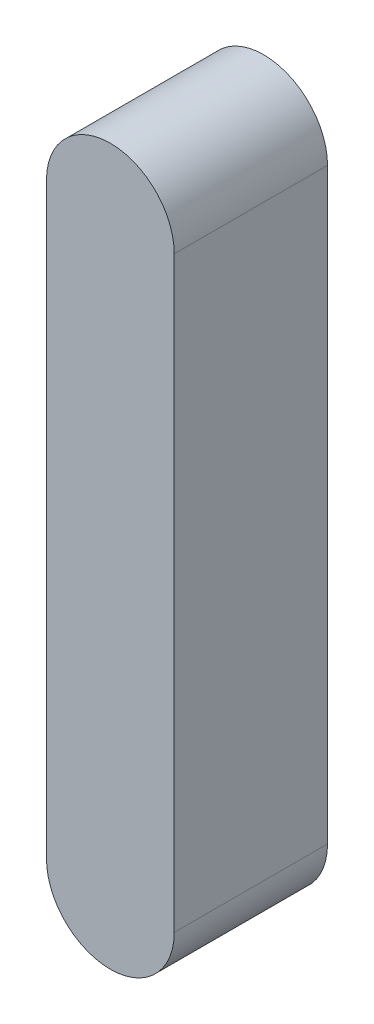
ISO-10303-21;
HEADER;
FILE_DESCRIPTION(('STEP AP214'),'2;1');
FILE_NAME('part.step','',(''),(''),'','','');
FILE_SCHEMA(('AUTOMOTIVE_DESIGN { 1 0 10303 214 1 1 1 1 }'));
ENDSEC;
DATA;
#1=APPLICATION_CONTEXT('core data for automotive mechanical design processes');
#2=APPLICATION_PROTOCOL_DEFINITION('international standard','automotive_design',2000,#1);
#3=PRODUCT_CONTEXT('',#1,'mechanical');
#4=PRODUCT('Part','Part','',(#3));
#5=PRODUCT_RELATED_PRODUCT_CATEGORY('part','',(#4));
#6=PRODUCT_DEFINITION_FORMATION('','',#4);
#7=PRODUCT_DEFINITION_CONTEXT('part definition',#1,'design');
#8=PRODUCT_DEFINITION('design','',#6,#7);
#9=PRODUCT_DEFINITION_SHAPE('','',#8);
#10=(LENGTH_UNIT() NAMED_UNIT(*) SI_UNIT(.MILLI.,.METRE.));
#11=(NAMED_UNIT(*) PLANE_ANGLE_UNIT() SI_UNIT($,.RADIAN.));
#12=(NAMED_UNIT(*) SI_UNIT($,.STERADIAN.) SOLID_ANGLE_UNIT());
#13=UNCERTAINTY_MEASURE_WITH_UNIT(LENGTH_MEASURE(1.E-05),#10,'distance_accuracy_value','');
#14=(GEOMETRIC_REPRESENTATION_CONTEXT(3) GLOBAL_UNCERTAINTY_ASSIGNED_CONTEXT((#13)) GLOBAL_UNIT_ASSIGNED_CONTEXT((#10,
#11,#12)) REPRESENTATION_CONTEXT('',''));
#15=CARTESIAN_POINT('',(0.,0.,0.));
#16=DIRECTION('',(0.,0.,1.));
#17=DIRECTION('',(1.,0.,0.));
#18=AXIS2_PLACEMENT_3D('',#15,#16,#17);
#19=CARTESIAN_POINT('',(0.,0.,15.));
#20=DIRECTION('',(0.,0.,-1.));
#21=DIRECTION('',(-1.,0.,0.));
#22=AXIS2_PLACEMENT_3D('',#19,#20,#21);
#23=CYLINDRICAL_SURFACE('',#22,12.5);
#24=CARTESIAN_POINT('',(0.,0.,-15.));
#25=DIRECTION('',(0.,0.,1.));
#26=DIRECTION('',(1.,0.,0.));
#27=AXIS2_PLACEMENT_3D('',#24,#25,#26);
#28=CIRCLE('',#27,12.5);
#29=CARTESIAN_POINT('',(-12.5,0.,-15.));
#30=VERTEX_POINT('',#29);
#31=CARTESIAN_POINT('',(12.5,0.,-15.));
#32=VERTEX_POINT('',#31);
#33=EDGE_CURVE('E106',#30,#32,#28,.T.);
#34=ORIENTED_EDGE('',*,*,#33,.T.);
#35=DIRECTION('',(0.,0.,-1.));
#36=VECTOR('',#35,1.);
#37=CARTESIAN_POINT('',(12.5,0.,15.));
#38=LINE('',#37,#36);
#39=CARTESIAN_POINT('',(12.5,0.,15.));
#40=VERTEX_POINT('',#39);
#41=EDGE_CURVE('E11',#40,#32,#38,.T.);
#42=ORIENTED_EDGE('',*,*,#41,.F.);
#43=CARTESIAN_POINT('',(0.,0.,15.));
#44=DIRECTION('',(0.,0.,1.));
#45=DIRECTION('',(1.,0.,0.));
#46=AXIS2_PLACEMENT_3D('',#43,#44,#45);
#47=CIRCLE('',#46,12.5);
#48=CARTESIAN_POINT('',(-12.5,0.,15.));
#49=VERTEX_POINT('',#48);
#50=EDGE_CURVE('E94',#49,#40,#47,.T.);
#51=ORIENTED_EDGE('',*,*,#50,.F.);
#52=DIRECTION('',(0.,0.,-1.));
#53=VECTOR('',#52,1.);
#54=CARTESIAN_POINT('',(-12.5,0.,15.));
#55=LINE('',#54,#53);
#56=EDGE_CURVE('E102',#49,#30,#55,.T.);
#57=ORIENTED_EDGE('',*,*,#56,.T.);
#58=EDGE_LOOP('',(#34,#42,#51,#57));
#59=FACE_BOUND('',#58,.T.);
#60=ADVANCED_FACE('F43',(#59),#23,.T.);
#61=CARTESIAN_POINT('',(12.5,0.,15.));
#62=DIRECTION('',(-1.,0.,0.));
#63=DIRECTION('',(0.,0.,1.));
#64=AXIS2_PLACEMENT_3D('',#61,#62,#63);
#65=PLANE('',#64);
#66=DIRECTION('',(0.,1.,0.));
#67=VECTOR('',#66,1.);
#68=CARTESIAN_POINT('',(12.5,0.,-15.));
#69=LINE('',#68,#67);
#70=CARTESIAN_POINT('',(12.5,115.,-15.));
#71=VERTEX_POINT('',#70);
#72=EDGE_CURVE('E98',#32,#71,#69,.T.);
#73=ORIENTED_EDGE('',*,*,#72,.T.);
#74=DIRECTION('',(0.,0.,-1.));
#75=VECTOR('',#74,1.);
#76=CARTESIAN_POINT('',(12.5,115.,15.));
#77=LINE('',#76,#75);
#78=CARTESIAN_POINT('',(12.5,115.,15.));
#79=VERTEX_POINT('',#78);
#80=EDGE_CURVE('E51',#79,#71,#77,.T.);
#81=ORIENTED_EDGE('',*,*,#80,.F.);
#82=DIRECTION('',(0.,1.,0.));
#83=VECTOR('',#82,1.);
#84=CARTESIAN_POINT('',(12.5,0.,15.));
#85=LINE('',#84,#83);
#86=EDGE_CURVE('E89',#40,#79,#85,.T.);
#87=ORIENTED_EDGE('',*,*,#86,.F.);
#88=ORIENTED_EDGE('',*,*,#41,.T.);
#89=EDGE_LOOP('',(#73,#81,#87,#88));
#90=FACE_BOUND('',#89,.T.);
#91=ADVANCED_FACE('F97',(#90),#65,.F.);
#92=CARTESIAN_POINT('',(0.,115.,15.));
#93=DIRECTION('',(0.,0.,-1.));
#94=DIRECTION('',(-1.,0.,0.));
#95=AXIS2_PLACEMENT_3D('',#92,#93,#94);
#96=CYLINDRICAL_SURFACE('',#95,12.5);
#97=CARTESIAN_POINT('',(0.,115.,-15.));
#98=DIRECTION('',(0.,0.,1.));
#99=DIRECTION('',(1.,0.,0.));
#100=AXIS2_PLACEMENT_3D('',#97,#98,#99);
#101=CIRCLE('',#100,12.5);
#102=CARTESIAN_POINT('',(-12.5,115.,-15.));
#103=VERTEX_POINT('',#102);
#104=EDGE_CURVE('E76',#71,#103,#101,.T.);
#105=ORIENTED_EDGE('',*,*,#104,.T.);
#106=DIRECTION('',(0.,0.,-1.));
#107=VECTOR('',#106,1.);
#108=CARTESIAN_POINT('',(-12.5,115.,15.));
#109=LINE('',#108,#107);
#110=CARTESIAN_POINT('',(-12.5,115.,15.));
#111=VERTEX_POINT('',#110);
#112=EDGE_CURVE('E99',#111,#103,#109,.T.);
#113=ORIENTED_EDGE('',*,*,#112,.F.);
#114=CARTESIAN_POINT('',(0.,115.,15.));
#115=DIRECTION('',(0.,0.,1.));
#116=DIRECTION('',(1.,0.,0.));
#117=AXIS2_PLACEMENT_3D('',#114,#115,#116);
#118=CIRCLE('',#117,12.5);
#119=EDGE_CURVE('E92',#79,#111,#118,.T.);
#120=ORIENTED_EDGE('',*,*,#119,.F.);
#121=ORIENTED_EDGE('',*,*,#80,.T.);
#122=EDGE_LOOP('',(#105,#113,#120,#121));
#123=FACE_BOUND('',#122,.T.);
#124=ADVANCED_FACE('F100',(#123),#96,.T.);
#125=CARTESIAN_POINT('',(-12.5,0.,15.));
#126=DIRECTION('',(1.,0.,0.));
#127=DIRECTION('',(0.,0.,-1.));
#128=AXIS2_PLACEMENT_3D('',#125,#126,#127);
#129=PLANE('',#128);
#130=DIRECTION('',(0.,-1.,0.));
#131=VECTOR('',#130,1.);
#132=CARTESIAN_POINT('',(-12.5,0.,-15.));
#133=LINE('',#132,#131);
#134=EDGE_CURVE('E82',#103,#30,#133,.T.);
#135=ORIENTED_EDGE('',*,*,#134,.T.);
#136=ORIENTED_EDGE('',*,*,#56,.F.);
#137=DIRECTION('',(0.,-1.,0.));
#138=VECTOR('',#137,1.);
#139=CARTESIAN_POINT('',(-12.5,0.,15.));
#140=LINE('',#139,#138);
#141=EDGE_CURVE('E59',#111,#49,#140,.T.);
#142=ORIENTED_EDGE('',*,*,#141,.F.);
#143=ORIENTED_EDGE('',*,*,#112,.T.);
#144=EDGE_LOOP('',(#135,#136,#142,#143));
#145=FACE_BOUND('',#144,.T.);
#146=ADVANCED_FACE('F113',(#145),#129,.F.);
#147=CARTESIAN_POINT('',(0.,0.,15.));
#148=DIRECTION('',(0.,0.,1.));
#149=DIRECTION('',(1.,0.,0.));
#150=AXIS2_PLACEMENT_3D('',#147,#148,#149);
#151=PLANE('',#150);
#152=ORIENTED_EDGE('',*,*,#50,.T.);
#153=ORIENTED_EDGE('',*,*,#86,.T.);
#154=ORIENTED_EDGE('',*,*,#119,.T.);
#155=ORIENTED_EDGE('',*,*,#141,.T.);
#156=EDGE_LOOP('',(#152,#153,#154,#155));
#157=FACE_BOUND('',#156,.T.);
#158=ADVANCED_FACE('F90',(#157),#151,.T.);
#159=CARTESIAN_POINT('',(0.,0.,-15.));
#160=DIRECTION('',(0.,0.,1.));
#161=DIRECTION('',(1.,0.,0.));
#162=AXIS2_PLACEMENT_3D('',#159,#160,#161);
#163=PLANE('',#162);
#164=ORIENTED_EDGE('',*,*,#33,.F.);
#165=ORIENTED_EDGE('',*,*,#134,.F.);
#166=ORIENTED_EDGE('',*,*,#104,.F.);
#167=ORIENTED_EDGE('',*,*,#72,.F.);
#168=EDGE_LOOP('',(#164,#165,#166,#167));
#169=FACE_BOUND('',#168,.T.);
#170=ADVANCED_FACE('F116',(#169),#163,.F.);
#171=CLOSED_SHELL('',(#60,#91,#124,#146,#158,#170));
#172=MANIFOLD_SOLID_BREP('B2',#171);
#173=ADVANCED_BREP_SHAPE_REPRESENTATION('',(#18,#172),#14);
#174=SHAPE_DEFINITION_REPRESENTATION(#9,#173);
ENDSEC;
END-ISO-10303-21;
